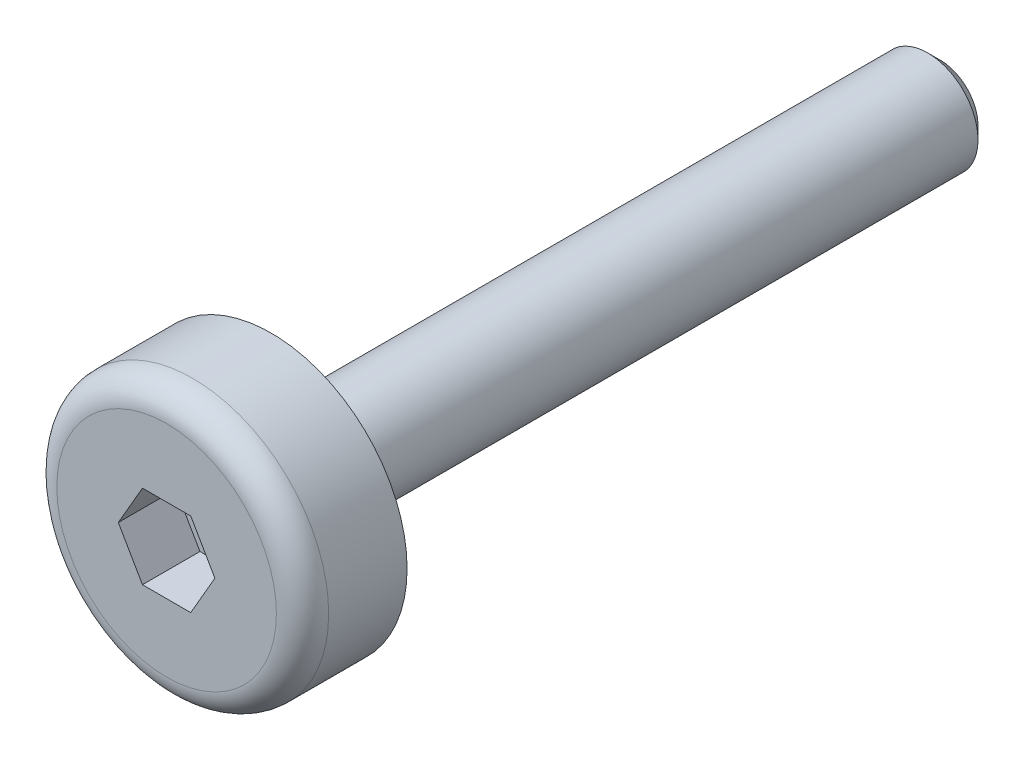
ISO-10303-21;
HEADER;
FILE_DESCRIPTION(('STEP AP214'),'2;1');
FILE_NAME('part.step','',(''),(''),'','','');
FILE_SCHEMA(('AUTOMOTIVE_DESIGN { 1 0 10303 214 1 1 1 1 }'));
ENDSEC;
DATA;
#1=APPLICATION_CONTEXT('core data for automotive mechanical design processes');
#2=APPLICATION_PROTOCOL_DEFINITION('international standard','automotive_design',2000,#1);
#3=PRODUCT_CONTEXT('',#1,'mechanical');
#4=PRODUCT('Part','Part','',(#3));
#5=PRODUCT_RELATED_PRODUCT_CATEGORY('part','',(#4));
#6=PRODUCT_DEFINITION_FORMATION('','',#4);
#7=PRODUCT_DEFINITION_CONTEXT('part definition',#1,'design');
#8=PRODUCT_DEFINITION('design','',#6,#7);
#9=PRODUCT_DEFINITION_SHAPE('','',#8);
#10=(LENGTH_UNIT() NAMED_UNIT(*) SI_UNIT(.MILLI.,.METRE.));
#11=(NAMED_UNIT(*) PLANE_ANGLE_UNIT() SI_UNIT($,.RADIAN.));
#12=(NAMED_UNIT(*) SI_UNIT($,.STERADIAN.) SOLID_ANGLE_UNIT());
#13=UNCERTAINTY_MEASURE_WITH_UNIT(LENGTH_MEASURE(1.E-05),#10,'distance_accuracy_value','');
#14=(GEOMETRIC_REPRESENTATION_CONTEXT(3) GLOBAL_UNCERTAINTY_ASSIGNED_CONTEXT((#13)) GLOBAL_UNIT_ASSIGNED_CONTEXT((#10,
#11,#12)) REPRESENTATION_CONTEXT('',''));
#15=CARTESIAN_POINT('',(0.,0.,0.));
#16=DIRECTION('',(0.,0.,1.));
#17=DIRECTION('',(1.,0.,0.));
#18=AXIS2_PLACEMENT_3D('',#15,#16,#17);
#19=CARTESIAN_POINT('',(0.,0.,-16.));
#20=DIRECTION('',(0.,0.,-1.));
#21=DIRECTION('',(-1.,0.,0.));
#22=AXIS2_PLACEMENT_3D('',#19,#20,#21);
#23=PLANE('',#22);
#24=CARTESIAN_POINT('',(0.,0.,-16.));
#25=DIRECTION('',(0.,0.,-1.));
#26=DIRECTION('',(-1.,0.,0.));
#27=AXIS2_PLACEMENT_3D('',#24,#25,#26);
#28=CIRCLE('',#27,0.9);
#29=CARTESIAN_POINT('',(-0.9,0.,-16.));
#30=VERTEX_POINT('',#29);
#31=EDGE_CURVE('E156',#30,#30,#28,.T.);
#32=ORIENTED_EDGE('',*,*,#31,.T.);
#33=EDGE_LOOP('',(#32));
#34=FACE_BOUND('',#33,.T.);
#35=ADVANCED_FACE('F40',(#34),#23,.T.);
#36=CARTESIAN_POINT('',(0.,0.,10.123));
#37=DIRECTION('',(0.,0.,1.));
#38=DIRECTION('',(1.,0.,0.));
#39=AXIS2_PLACEMENT_3D('',#36,#37,#38);
#40=CYLINDRICAL_SURFACE('',#39,1.2);
#41=CARTESIAN_POINT('',(0.,0.,-15.7));
#42=DIRECTION('',(0.,0.,-1.));
#43=DIRECTION('',(-1.,0.,0.));
#44=AXIS2_PLACEMENT_3D('',#41,#42,#43);
#45=CIRCLE('',#44,1.2);
#46=CARTESIAN_POINT('',(-1.2,0.,-15.7));
#47=VERTEX_POINT('',#46);
#48=EDGE_CURVE('E153',#47,#47,#45,.F.);
#49=ORIENTED_EDGE('',*,*,#48,.T.);
#50=EDGE_LOOP('',(#49));
#51=FACE_BOUND('',#50,.T.);
#52=CARTESIAN_POINT('',(0.,0.,0.));
#53=DIRECTION('',(0.,0.,1.));
#54=DIRECTION('',(1.,0.,0.));
#55=AXIS2_PLACEMENT_3D('',#52,#53,#54);
#56=CIRCLE('',#55,1.2);
#57=CARTESIAN_POINT('',(1.2,0.,0.));
#58=VERTEX_POINT('',#57);
#59=EDGE_CURVE('E150',#58,#58,#56,.T.);
#60=ORIENTED_EDGE('',*,*,#59,.F.);
#61=EDGE_LOOP('',(#60));
#62=FACE_BOUND('',#61,.T.);
#63=ADVANCED_FACE('F176',(#51,#62),#40,.T.);
#64=CARTESIAN_POINT('',(1.2,0.,0.));
#65=DIRECTION('',(0.,0.,-1.));
#66=DIRECTION('',(-1.,0.,0.));
#67=AXIS2_PLACEMENT_3D('',#64,#65,#66);
#68=PLANE('',#67);
#69=ORIENTED_EDGE('',*,*,#59,.T.);
#70=EDGE_LOOP('',(#69));
#71=FACE_BOUND('',#70,.T.);
#72=CARTESIAN_POINT('',(0.,0.,0.));
#73=DIRECTION('',(0.,0.,1.));
#74=DIRECTION('',(1.,0.,0.));
#75=AXIS2_PLACEMENT_3D('',#72,#73,#74);
#76=CIRCLE('',#75,3.25);
#77=CARTESIAN_POINT('',(3.25,0.,0.));
#78=VERTEX_POINT('',#77);
#79=EDGE_CURVE('E142',#78,#78,#76,.T.);
#80=ORIENTED_EDGE('',*,*,#79,.F.);
#81=EDGE_LOOP('',(#80));
#82=FACE_BOUND('',#81,.T.);
#83=ADVANCED_FACE('F182',(#71,#82),#68,.T.);
#84=CARTESIAN_POINT('',(0.,0.,10.123));
#85=DIRECTION('',(0.,0.,1.));
#86=DIRECTION('',(1.,0.,0.));
#87=AXIS2_PLACEMENT_3D('',#84,#85,#86);
#88=CYLINDRICAL_SURFACE('',#87,3.25);
#89=CARTESIAN_POINT('',(0.,0.,1.875));
#90=DIRECTION('',(0.,0.,1.));
#91=DIRECTION('',(1.,0.,0.));
#92=AXIS2_PLACEMENT_3D('',#89,#90,#91);
#93=CIRCLE('',#92,3.25);
#94=CARTESIAN_POINT('',(3.25,0.,1.875));
#95=VERTEX_POINT('',#94);
#96=EDGE_CURVE('E11',#95,#95,#93,.F.);
#97=ORIENTED_EDGE('',*,*,#96,.T.);
#98=EDGE_LOOP('',(#97));
#99=FACE_BOUND('',#98,.T.);
#100=ORIENTED_EDGE('',*,*,#79,.T.);
#101=EDGE_LOOP('',(#100));
#102=FACE_BOUND('',#101,.T.);
#103=ADVANCED_FACE('F191',(#99,#102),#88,.T.);
#104=CARTESIAN_POINT('',(3.25,0.,2.5));
#105=DIRECTION('',(0.,0.,1.));
#106=DIRECTION('',(1.,0.,0.));
#107=AXIS2_PLACEMENT_3D('',#104,#105,#106);
#108=PLANE('',#107);
#109=DIRECTION('',(0.499999999999995,0.866025403784441,0.));
#110=VECTOR('',#109,1.);
#111=CARTESIAN_POINT('',(0.577350269189637,-0.999999999999993,2.5));
#112=LINE('',#111,#110);
#113=CARTESIAN_POINT('',(0.577350269189637,-0.999999999999993,2.5));
#114=VERTEX_POINT('',#113);
#115=CARTESIAN_POINT('',(1.15470053837925,0.,2.5));
#116=VERTEX_POINT('',#115);
#117=EDGE_CURVE('E55',#114,#116,#112,.T.);
#118=ORIENTED_EDGE('',*,*,#117,.F.);
#119=DIRECTION('',(1.,0.,0.));
#120=VECTOR('',#119,1.);
#121=CARTESIAN_POINT('',(-0.577350269189617,-1.00000000000001,2.5));
#122=LINE('',#121,#120);
#123=CARTESIAN_POINT('',(-0.577350269189617,-1.00000000000001,2.5));
#124=VERTEX_POINT('',#123);
#125=EDGE_CURVE('E138',#124,#114,#122,.T.);
#126=ORIENTED_EDGE('',*,*,#125,.F.);
#127=DIRECTION('',(0.500000000000007,-0.866025403784434,0.));
#128=VECTOR('',#127,1.);
#129=CARTESIAN_POINT('',(-1.15470053837925,0.,2.5));
#130=LINE('',#129,#128);
#131=CARTESIAN_POINT('',(-1.15470053837925,0.,2.5));
#132=VERTEX_POINT('',#131);
#133=EDGE_CURVE('E136',#132,#124,#130,.T.);
#134=ORIENTED_EDGE('',*,*,#133,.F.);
#135=DIRECTION('',(-0.499999999999995,-0.866025403784442,0.));
#136=VECTOR('',#135,1.);
#137=CARTESIAN_POINT('',(-0.57735026918963,0.999999999999998,2.5));
#138=LINE('',#137,#136);
#139=CARTESIAN_POINT('',(-0.57735026918963,0.999999999999998,2.5));
#140=VERTEX_POINT('',#139);
#141=EDGE_CURVE('E103',#140,#132,#138,.T.);
#142=ORIENTED_EDGE('',*,*,#141,.F.);
#143=DIRECTION('',(-1.,0.,0.));
#144=VECTOR('',#143,1.);
#145=CARTESIAN_POINT('',(0.577350269189624,1.,2.5));
#146=LINE('',#145,#144);
#147=CARTESIAN_POINT('',(0.577350269189624,1.,2.5));
#148=VERTEX_POINT('',#147);
#149=EDGE_CURVE('E132',#148,#140,#146,.T.);
#150=ORIENTED_EDGE('',*,*,#149,.F.);
#151=DIRECTION('',(-0.500000000000001,0.866025403784438,0.));
#152=VECTOR('',#151,1.);
#153=CARTESIAN_POINT('',(1.15470053837925,0.,2.5));
#154=LINE('',#153,#152);
#155=EDGE_CURVE('E129',#116,#148,#154,.T.);
#156=ORIENTED_EDGE('',*,*,#155,.F.);
#157=EDGE_LOOP('',(#118,#126,#134,#142,#150,#156));
#158=FACE_BOUND('',#157,.T.);
#159=CARTESIAN_POINT('',(0.,0.,2.5));
#160=DIRECTION('',(0.,0.,1.));
#161=DIRECTION('',(1.,0.,0.));
#162=AXIS2_PLACEMENT_3D('',#159,#160,#161);
#163=CIRCLE('',#162,2.625);
#164=CARTESIAN_POINT('',(2.625,0.,2.5));
#165=VERTEX_POINT('',#164);
#166=EDGE_CURVE('E48',#165,#165,#163,.T.);
#167=ORIENTED_EDGE('',*,*,#166,.T.);
#168=EDGE_LOOP('',(#167));
#169=FACE_BOUND('',#168,.T.);
#170=ADVANCED_FACE('F161',(#158,#169),#108,.T.);
#171=CARTESIAN_POINT('',(0.,0.,-15.7));
#172=DIRECTION('',(0.,0.,1.));
#173=DIRECTION('',(1.,0.,0.));
#174=AXIS2_PLACEMENT_3D('',#171,#172,#173);
#175=CONICAL_SURFACE('',#174,1.2,0.785398163397446);
#176=ORIENTED_EDGE('',*,*,#31,.F.);
#177=EDGE_LOOP('',(#176));
#178=FACE_BOUND('',#177,.T.);
#179=ORIENTED_EDGE('',*,*,#48,.F.);
#180=EDGE_LOOP('',(#179));
#181=FACE_BOUND('',#180,.T.);
#182=ADVANCED_FACE('F165',(#178,#181),#175,.T.);
#183=CARTESIAN_POINT('',(0.,0.,1.875));
#184=DIRECTION('',(0.,0.,1.));
#185=DIRECTION('',(1.,0.,0.));
#186=AXIS2_PLACEMENT_3D('',#183,#184,#185);
#187=TOROIDAL_SURFACE('',#186,2.625,0.625);
#188=ORIENTED_EDGE('',*,*,#96,.F.);
#189=EDGE_LOOP('',(#188));
#190=FACE_BOUND('',#189,.T.);
#191=ORIENTED_EDGE('',*,*,#166,.F.);
#192=EDGE_LOOP('',(#191));
#193=FACE_BOUND('',#192,.T.);
#194=ADVANCED_FACE('F42',(#190,#193),#187,.T.);
#195=CARTESIAN_POINT('',(0.577350269189637,-0.999999999999993,1.125));
#196=DIRECTION('',(0.866025403784441,-0.499999999999995,0.));
#197=DIRECTION('',(0.499999999999995,0.866025403784441,0.));
#198=AXIS2_PLACEMENT_3D('',#195,#196,#197);
#199=PLANE('',#198);
#200=ORIENTED_EDGE('',*,*,#117,.T.);
#201=DIRECTION('',(0.,0.,1.));
#202=VECTOR('',#201,1.);
#203=CARTESIAN_POINT('',(1.15470053837925,0.,1.125));
#204=LINE('',#203,#202);
#205=CARTESIAN_POINT('',(1.15470053837925,0.,1.125));
#206=VERTEX_POINT('',#205);
#207=EDGE_CURVE('E85',#206,#116,#204,.T.);
#208=ORIENTED_EDGE('',*,*,#207,.F.);
#209=DIRECTION('',(0.499999999999995,0.866025403784441,0.));
#210=VECTOR('',#209,1.);
#211=CARTESIAN_POINT('',(0.577350269189637,-0.999999999999993,1.125));
#212=LINE('',#211,#210);
#213=CARTESIAN_POINT('',(0.577350269189637,-0.999999999999993,1.125));
#214=VERTEX_POINT('',#213);
#215=EDGE_CURVE('E140',#214,#206,#212,.T.);
#216=ORIENTED_EDGE('',*,*,#215,.F.);
#217=DIRECTION('',(0.,0.,1.));
#218=VECTOR('',#217,1.);
#219=CARTESIAN_POINT('',(0.577350269189637,-0.999999999999993,1.125));
#220=LINE('',#219,#218);
#221=EDGE_CURVE('E63',#214,#114,#220,.T.);
#222=ORIENTED_EDGE('',*,*,#221,.T.);
#223=EDGE_LOOP('',(#200,#208,#216,#222));
#224=FACE_BOUND('',#223,.T.);
#225=ADVANCED_FACE('F164',(#224),#199,.F.);
#226=CARTESIAN_POINT('',(-0.577350269189617,-1.00000000000001,1.125));
#227=DIRECTION('',(0.,-1.,0.));
#228=DIRECTION('',(1.,0.,0.));
#229=AXIS2_PLACEMENT_3D('',#226,#227,#228);
#230=PLANE('',#229);
#231=ORIENTED_EDGE('',*,*,#125,.T.);
#232=ORIENTED_EDGE('',*,*,#221,.F.);
#233=DIRECTION('',(1.,0.,0.));
#234=VECTOR('',#233,1.);
#235=CARTESIAN_POINT('',(-0.577350269189617,-1.00000000000001,1.125));
#236=LINE('',#235,#234);
#237=CARTESIAN_POINT('',(-0.577350269189617,-1.00000000000001,1.125));
#238=VERTEX_POINT('',#237);
#239=EDGE_CURVE('E115',#238,#214,#236,.T.);
#240=ORIENTED_EDGE('',*,*,#239,.F.);
#241=DIRECTION('',(0.,0.,1.));
#242=VECTOR('',#241,1.);
#243=CARTESIAN_POINT('',(-0.577350269189617,-1.00000000000001,1.125));
#244=LINE('',#243,#242);
#245=EDGE_CURVE('E107',#238,#124,#244,.T.);
#246=ORIENTED_EDGE('',*,*,#245,.T.);
#247=EDGE_LOOP('',(#231,#232,#240,#246));
#248=FACE_BOUND('',#247,.T.);
#249=ADVANCED_FACE('F171',(#248),#230,.F.);
#250=CARTESIAN_POINT('',(-1.15470053837925,0.,1.125));
#251=DIRECTION('',(-0.866025403784435,-0.500000000000007,0.));
#252=DIRECTION('',(0.500000000000007,-0.866025403784435,0.));
#253=AXIS2_PLACEMENT_3D('',#250,#251,#252);
#254=PLANE('',#253);
#255=ORIENTED_EDGE('',*,*,#133,.T.);
#256=ORIENTED_EDGE('',*,*,#245,.F.);
#257=DIRECTION('',(0.500000000000007,-0.866025403784434,0.));
#258=VECTOR('',#257,1.);
#259=CARTESIAN_POINT('',(-1.15470053837925,0.,1.125));
#260=LINE('',#259,#258);
#261=CARTESIAN_POINT('',(-1.15470053837925,0.,1.125));
#262=VERTEX_POINT('',#261);
#263=EDGE_CURVE('E111',#262,#238,#260,.T.);
#264=ORIENTED_EDGE('',*,*,#263,.F.);
#265=DIRECTION('',(0.,0.,1.));
#266=VECTOR('',#265,1.);
#267=CARTESIAN_POINT('',(-1.15470053837925,0.,1.125));
#268=LINE('',#267,#266);
#269=EDGE_CURVE('E96',#262,#132,#268,.T.);
#270=ORIENTED_EDGE('',*,*,#269,.T.);
#271=EDGE_LOOP('',(#255,#256,#264,#270));
#272=FACE_BOUND('',#271,.T.);
#273=ADVANCED_FACE('F112',(#272),#254,.F.);
#274=CARTESIAN_POINT('',(-0.57735026918963,0.999999999999998,1.125));
#275=DIRECTION('',(-0.866025403784442,0.499999999999995,0.));
#276=DIRECTION('',(-0.499999999999995,-0.866025403784441,0.));
#277=AXIS2_PLACEMENT_3D('',#274,#275,#276);
#278=PLANE('',#277);
#279=ORIENTED_EDGE('',*,*,#141,.T.);
#280=ORIENTED_EDGE('',*,*,#269,.F.);
#281=DIRECTION('',(-0.499999999999995,-0.866025403784442,0.));
#282=VECTOR('',#281,1.);
#283=CARTESIAN_POINT('',(-0.57735026918963,0.999999999999998,1.125));
#284=LINE('',#283,#282);
#285=CARTESIAN_POINT('',(-0.57735026918963,0.999999999999998,1.125));
#286=VERTEX_POINT('',#285);
#287=EDGE_CURVE('E100',#286,#262,#284,.T.);
#288=ORIENTED_EDGE('',*,*,#287,.F.);
#289=DIRECTION('',(0.,0.,1.));
#290=VECTOR('',#289,1.);
#291=CARTESIAN_POINT('',(-0.57735026918963,0.999999999999998,1.125));
#292=LINE('',#291,#290);
#293=EDGE_CURVE('E108',#286,#140,#292,.T.);
#294=ORIENTED_EDGE('',*,*,#293,.T.);
#295=EDGE_LOOP('',(#279,#280,#288,#294));
#296=FACE_BOUND('',#295,.T.);
#297=ADVANCED_FACE('F98',(#296),#278,.F.);
#298=CARTESIAN_POINT('',(0.577350269189624,1.,1.125));
#299=DIRECTION('',(0.,1.,0.));
#300=DIRECTION('',(-1.,0.,0.));
#301=AXIS2_PLACEMENT_3D('',#298,#299,#300);
#302=PLANE('',#301);
#303=ORIENTED_EDGE('',*,*,#149,.T.);
#304=ORIENTED_EDGE('',*,*,#293,.F.);
#305=DIRECTION('',(-1.,0.,0.));
#306=VECTOR('',#305,1.);
#307=CARTESIAN_POINT('',(0.577350269189624,1.,1.125));
#308=LINE('',#307,#306);
#309=CARTESIAN_POINT('',(0.577350269189624,1.,1.125));
#310=VERTEX_POINT('',#309);
#311=EDGE_CURVE('E121',#310,#286,#308,.T.);
#312=ORIENTED_EDGE('',*,*,#311,.F.);
#313=DIRECTION('',(0.,0.,1.));
#314=VECTOR('',#313,1.);
#315=CARTESIAN_POINT('',(0.577350269189624,1.,1.125));
#316=LINE('',#315,#314);
#317=EDGE_CURVE('E145',#310,#148,#316,.T.);
#318=ORIENTED_EDGE('',*,*,#317,.T.);
#319=EDGE_LOOP('',(#303,#304,#312,#318));
#320=FACE_BOUND('',#319,.T.);
#321=ADVANCED_FACE('F202',(#320),#302,.F.);
#322=CARTESIAN_POINT('',(1.15470053837925,0.,1.125));
#323=DIRECTION('',(0.866025403784438,0.500000000000001,0.));
#324=DIRECTION('',(-0.500000000000001,0.866025403784438,0.));
#325=AXIS2_PLACEMENT_3D('',#322,#323,#324);
#326=PLANE('',#325);
#327=ORIENTED_EDGE('',*,*,#155,.T.);
#328=ORIENTED_EDGE('',*,*,#317,.F.);
#329=DIRECTION('',(-0.500000000000001,0.866025403784438,0.));
#330=VECTOR('',#329,1.);
#331=CARTESIAN_POINT('',(1.15470053837925,0.,1.125));
#332=LINE('',#331,#330);
#333=EDGE_CURVE('E123',#206,#310,#332,.T.);
#334=ORIENTED_EDGE('',*,*,#333,.F.);
#335=ORIENTED_EDGE('',*,*,#207,.T.);
#336=EDGE_LOOP('',(#327,#328,#334,#335));
#337=FACE_BOUND('',#336,.T.);
#338=ADVANCED_FACE('F199',(#337),#326,.F.);
#339=CARTESIAN_POINT('',(0.,0.,1.125));
#340=DIRECTION('',(0.,0.,1.));
#341=DIRECTION('',(1.,0.,0.));
#342=AXIS2_PLACEMENT_3D('',#339,#340,#341);
#343=PLANE('',#342);
#344=ORIENTED_EDGE('',*,*,#215,.T.);
#345=ORIENTED_EDGE('',*,*,#333,.T.);
#346=ORIENTED_EDGE('',*,*,#311,.T.);
#347=ORIENTED_EDGE('',*,*,#287,.T.);
#348=ORIENTED_EDGE('',*,*,#263,.T.);
#349=ORIENTED_EDGE('',*,*,#239,.T.);
#350=EDGE_LOOP('',(#344,#345,#346,#347,#348,#349));
#351=FACE_BOUND('',#350,.T.);
#352=ADVANCED_FACE('F118',(#351),#343,.T.);
#353=CLOSED_SHELL('',(#35,#63,#83,#103,#170,#182,#194,#225,#249,#273,#297,#321,#338,#352));
#354=MANIFOLD_SOLID_BREP('B2',#353);
#355=ADVANCED_BREP_SHAPE_REPRESENTATION('',(#18,#354),#14);
#356=SHAPE_DEFINITION_REPRESENTATION(#9,#355);
ENDSEC;
END-ISO-10303-21;
